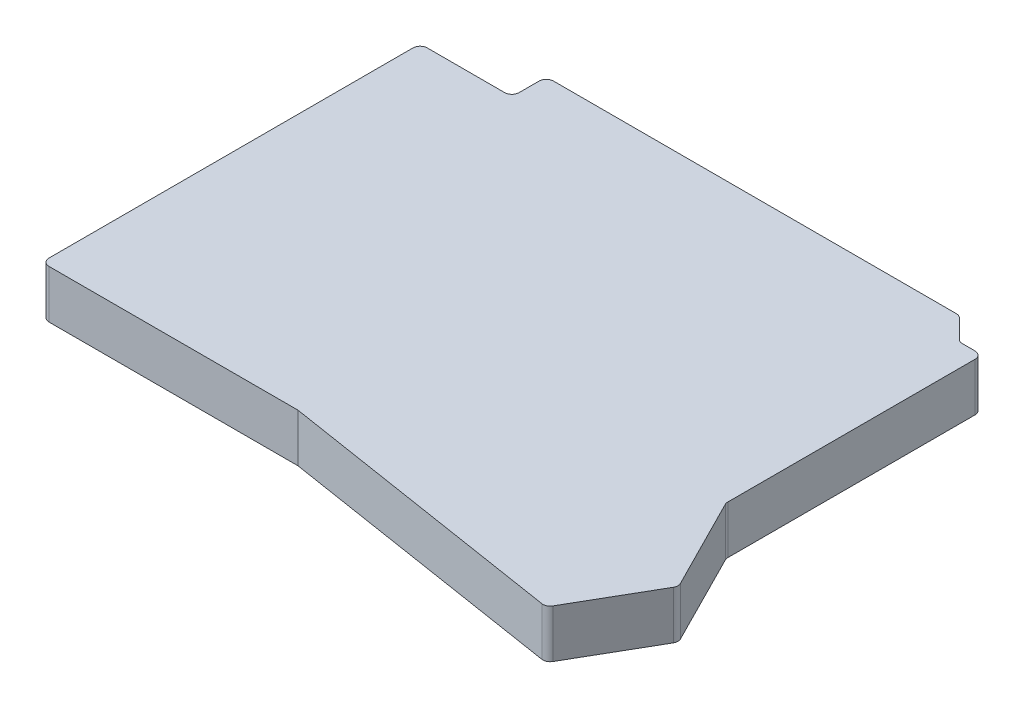
ISO-10303-21;
HEADER;
FILE_DESCRIPTION(('STEP AP214'),'2;1');
FILE_NAME('part.step','',(''),(''),'','','');
FILE_SCHEMA(('AUTOMOTIVE_DESIGN { 1 0 10303 214 1 1 1 1 }'));
ENDSEC;
DATA;
#1=APPLICATION_CONTEXT('core data for automotive mechanical design processes');
#2=APPLICATION_PROTOCOL_DEFINITION('international standard','automotive_design',2000,#1);
#3=PRODUCT_CONTEXT('',#1,'mechanical');
#4=PRODUCT('Part','Part','',(#3));
#5=PRODUCT_RELATED_PRODUCT_CATEGORY('part','',(#4));
#6=PRODUCT_DEFINITION_FORMATION('','',#4);
#7=PRODUCT_DEFINITION_CONTEXT('part definition',#1,'design');
#8=PRODUCT_DEFINITION('design','',#6,#7);
#9=PRODUCT_DEFINITION_SHAPE('','',#8);
#10=(LENGTH_UNIT() NAMED_UNIT(*) SI_UNIT(.MILLI.,.METRE.));
#11=(NAMED_UNIT(*) PLANE_ANGLE_UNIT() SI_UNIT($,.RADIAN.));
#12=(NAMED_UNIT(*) SI_UNIT($,.STERADIAN.) SOLID_ANGLE_UNIT());
#13=UNCERTAINTY_MEASURE_WITH_UNIT(LENGTH_MEASURE(1.E-05),#10,'distance_accuracy_value','');
#14=(GEOMETRIC_REPRESENTATION_CONTEXT(3) GLOBAL_UNCERTAINTY_ASSIGNED_CONTEXT((#13)) GLOBAL_UNIT_ASSIGNED_CONTEXT((#10,
#11,#12)) REPRESENTATION_CONTEXT('',''));
#15=CARTESIAN_POINT('',(0.,0.,0.));
#16=DIRECTION('',(0.,0.,1.));
#17=DIRECTION('',(1.,0.,0.));
#18=AXIS2_PLACEMENT_3D('',#15,#16,#17);
#19=CARTESIAN_POINT('',(1.5,10.,19.87));
#20=DIRECTION('',(0.,-1.,0.));
#21=DIRECTION('',(0.,0.,-1.));
#22=AXIS2_PLACEMENT_3D('',#19,#20,#21);
#23=CYLINDRICAL_SURFACE('',#22,1.5);
#24=CARTESIAN_POINT('',(1.5,0.,19.87));
#25=DIRECTION('',(0.,1.,0.));
#26=DIRECTION('',(0.,0.,1.));
#27=AXIS2_PLACEMENT_3D('',#24,#25,#26);
#28=CIRCLE('',#27,1.5);
#29=CARTESIAN_POINT('',(0.,0.,19.87));
#30=VERTEX_POINT('',#29);
#31=CARTESIAN_POINT('',(1.50000000000001,0.,21.37));
#32=VERTEX_POINT('',#31);
#33=EDGE_CURVE('E217',#30,#32,#28,.T.);
#34=ORIENTED_EDGE('',*,*,#33,.T.);
#35=DIRECTION('',(0.,-1.,0.));
#36=VECTOR('',#35,1.);
#37=CARTESIAN_POINT('',(1.50000000000001,10.,21.37));
#38=LINE('',#37,#36);
#39=CARTESIAN_POINT('',(1.50000000000001,10.,21.37));
#40=VERTEX_POINT('',#39);
#41=EDGE_CURVE('E41',#40,#32,#38,.T.);
#42=ORIENTED_EDGE('',*,*,#41,.F.);
#43=CARTESIAN_POINT('',(1.5,10.,19.87));
#44=DIRECTION('',(0.,1.,0.));
#45=DIRECTION('',(0.,0.,1.));
#46=AXIS2_PLACEMENT_3D('',#43,#44,#45);
#47=CIRCLE('',#46,1.5);
#48=CARTESIAN_POINT('',(0.,10.,19.87));
#49=VERTEX_POINT('',#48);
#50=EDGE_CURVE('E135',#49,#40,#47,.T.);
#51=ORIENTED_EDGE('',*,*,#50,.F.);
#52=DIRECTION('',(0.,-1.,0.));
#53=VECTOR('',#52,1.);
#54=CARTESIAN_POINT('',(0.,10.,19.87));
#55=LINE('',#54,#53);
#56=EDGE_CURVE('E11',#49,#30,#55,.T.);
#57=ORIENTED_EDGE('',*,*,#56,.T.);
#58=EDGE_LOOP('',(#34,#42,#51,#57));
#59=FACE_BOUND('',#58,.T.);
#60=ADVANCED_FACE('F33',(#59),#23,.T.);
#61=CARTESIAN_POINT('',(1.50000000000001,10.,21.37));
#62=DIRECTION('',(0.,0.,-1.));
#63=DIRECTION('',(-1.,0.,0.));
#64=AXIS2_PLACEMENT_3D('',#61,#62,#63);
#65=PLANE('',#64);
#66=DIRECTION('',(1.,0.,0.));
#67=VECTOR('',#66,1.);
#68=CARTESIAN_POINT('',(1.50000000000001,0.,21.37));
#69=LINE('',#68,#67);
#70=CARTESIAN_POINT('',(53.0324982708608,0.,21.37));
#71=VERTEX_POINT('',#70);
#72=EDGE_CURVE('E219',#32,#71,#69,.T.);
#73=ORIENTED_EDGE('',*,*,#72,.T.);
#74=DIRECTION('',(0.,-1.,0.));
#75=VECTOR('',#74,1.);
#76=CARTESIAN_POINT('',(53.0324982708608,10.,21.37));
#77=LINE('',#76,#75);
#78=CARTESIAN_POINT('',(53.0324982708608,10.,21.37));
#79=VERTEX_POINT('',#78);
#80=EDGE_CURVE('E306',#79,#71,#77,.T.);
#81=ORIENTED_EDGE('',*,*,#80,.F.);
#82=DIRECTION('',(1.,0.,0.));
#83=VECTOR('',#82,1.);
#84=CARTESIAN_POINT('',(1.50000000000001,10.,21.37));
#85=LINE('',#84,#83);
#86=EDGE_CURVE('E314',#40,#79,#85,.T.);
#87=ORIENTED_EDGE('',*,*,#86,.F.);
#88=ORIENTED_EDGE('',*,*,#41,.T.);
#89=EDGE_LOOP('',(#73,#81,#87,#88));
#90=FACE_BOUND('',#89,.T.);
#91=ADVANCED_FACE('F312',(#90),#65,.F.);
#92=CARTESIAN_POINT('',(53.0324982708608,10.,22.87));
#93=DIRECTION('',(0.,-1.,0.));
#94=DIRECTION('',(0.,0.,-1.));
#95=AXIS2_PLACEMENT_3D('',#92,#93,#94);
#96=CYLINDRICAL_SURFACE('',#95,1.5);
#97=CARTESIAN_POINT('',(53.0324982708608,0.,22.87));
#98=DIRECTION('',(0.,-1.,0.));
#99=DIRECTION('',(0.,0.,-1.));
#100=AXIS2_PLACEMENT_3D('',#97,#98,#99);
#101=CIRCLE('',#100,1.5);
#102=CARTESIAN_POINT('',(53.2660684742362,0.,21.388296601848));
#103=VERTEX_POINT('',#102);
#104=EDGE_CURVE('E221',#71,#103,#101,.T.);
#105=ORIENTED_EDGE('',*,*,#104,.T.);
#106=DIRECTION('',(0.,-1.,0.));
#107=VECTOR('',#106,1.);
#108=CARTESIAN_POINT('',(53.2660684742362,10.,21.388296601848));
#109=LINE('',#108,#107);
#110=CARTESIAN_POINT('',(53.2660684742362,10.,21.388296601848));
#111=VERTEX_POINT('',#110);
#112=EDGE_CURVE('E303',#111,#103,#109,.T.);
#113=ORIENTED_EDGE('',*,*,#112,.F.);
#114=CARTESIAN_POINT('',(53.0324982708608,10.,22.87));
#115=DIRECTION('',(0.,-1.,0.));
#116=DIRECTION('',(0.,0.,-1.));
#117=AXIS2_PLACEMENT_3D('',#114,#115,#116);
#118=CIRCLE('',#117,1.5);
#119=EDGE_CURVE('E333',#79,#111,#118,.T.);
#120=ORIENTED_EDGE('',*,*,#119,.F.);
#121=ORIENTED_EDGE('',*,*,#80,.T.);
#122=EDGE_LOOP('',(#105,#113,#120,#121));
#123=FACE_BOUND('',#122,.T.);
#124=ADVANCED_FACE('F324',(#123),#96,.F.);
#125=CARTESIAN_POINT('',(53.2660684742362,10.,21.388296601848));
#126=DIRECTION('',(0.155713468916939,0.,-0.987802265434663));
#127=DIRECTION('',(-0.987802265434664,0.,-0.155713468916939));
#128=AXIS2_PLACEMENT_3D('',#125,#126,#127);
#129=PLANE('',#128);
#130=DIRECTION('',(0.987802265434664,0.,0.155713468916939));
#131=VECTOR('',#130,1.);
#132=CARTESIAN_POINT('',(53.2660684742362,0.,21.388296601848));
#133=LINE('',#132,#131);
#134=CARTESIAN_POINT('',(113.222449486146,0.,30.8395971280339));
#135=VERTEX_POINT('',#134);
#136=EDGE_CURVE('E223',#103,#135,#133,.T.);
#137=ORIENTED_EDGE('',*,*,#136,.T.);
#138=DIRECTION('',(0.,-1.,0.));
#139=VECTOR('',#138,1.);
#140=CARTESIAN_POINT('',(113.222449486146,10.,30.8395971280339));
#141=LINE('',#140,#139);
#142=CARTESIAN_POINT('',(113.222449486146,10.,30.8395971280339));
#143=VERTEX_POINT('',#142);
#144=EDGE_CURVE('E300',#143,#135,#141,.T.);
#145=ORIENTED_EDGE('',*,*,#144,.F.);
#146=DIRECTION('',(0.987802265434664,0.,0.155713468916939));
#147=VECTOR('',#146,1.);
#148=CARTESIAN_POINT('',(53.2660684742362,10.,21.388296601848));
#149=LINE('',#148,#147);
#150=EDGE_CURVE('E330',#111,#143,#149,.T.);
#151=ORIENTED_EDGE('',*,*,#150,.F.);
#152=ORIENTED_EDGE('',*,*,#112,.T.);
#153=EDGE_LOOP('',(#137,#145,#151,#152));
#154=FACE_BOUND('',#153,.T.);
#155=ADVANCED_FACE('F328',(#154),#129,.F.);
#156=CARTESIAN_POINT('',(113.456019689522,10.,29.3578937298819));
#157=DIRECTION('',(0.,-1.,0.));
#158=DIRECTION('',(0.,0.,-1.));
#159=AXIS2_PLACEMENT_3D('',#156,#157,#158);
#160=CYLINDRICAL_SURFACE('',#159,1.5);
#161=CARTESIAN_POINT('',(113.456019689522,0.,29.3578937298819));
#162=DIRECTION('',(0.,1.,0.));
#163=DIRECTION('',(0.,0.,-1.));
#164=AXIS2_PLACEMENT_3D('',#161,#162,#163);
#165=CIRCLE('',#164,1.5);
#166=CARTESIAN_POINT('',(114.755057795198,0.,30.1078937298819));
#167=VERTEX_POINT('',#166);
#168=EDGE_CURVE('E225',#135,#167,#165,.T.);
#169=ORIENTED_EDGE('',*,*,#168,.T.);
#170=DIRECTION('',(0.,-1.,0.));
#171=VECTOR('',#170,1.);
#172=CARTESIAN_POINT('',(114.755057795198,10.,30.1078937298819));
#173=LINE('',#172,#171);
#174=CARTESIAN_POINT('',(114.755057795198,10.,30.1078937298819));
#175=VERTEX_POINT('',#174);
#176=EDGE_CURVE('E297',#175,#167,#173,.T.);
#177=ORIENTED_EDGE('',*,*,#176,.F.);
#178=CARTESIAN_POINT('',(113.456019689522,10.,29.3578937298819));
#179=DIRECTION('',(0.,1.,0.));
#180=DIRECTION('',(0.,0.,-1.));
#181=AXIS2_PLACEMENT_3D('',#178,#179,#180);
#182=CIRCLE('',#181,1.5);
#183=EDGE_CURVE('E332',#143,#175,#182,.T.);
#184=ORIENTED_EDGE('',*,*,#183,.F.);
#185=ORIENTED_EDGE('',*,*,#144,.T.);
#186=EDGE_LOOP('',(#169,#177,#184,#185));
#187=FACE_BOUND('',#186,.T.);
#188=ADVANCED_FACE('F395',(#187),#160,.T.);
#189=CARTESIAN_POINT('',(114.755057795198,10.,30.1078937298819));
#190=DIRECTION('',(-0.86602540378444,0.,-0.499999999999997));
#191=DIRECTION('',(-0.499999999999997,0.,0.86602540378444));
#192=AXIS2_PLACEMENT_3D('',#189,#190,#191);
#193=PLANE('',#192);
#194=DIRECTION('',(0.499999999999997,0.,-0.86602540378444));
#195=VECTOR('',#194,1.);
#196=CARTESIAN_POINT('',(114.755057795198,0.,30.1078937298819));
#197=LINE('',#196,#195);
#198=CARTESIAN_POINT('',(123.908801296402,0.,14.2531449063435));
#199=VERTEX_POINT('',#198);
#200=EDGE_CURVE('E227',#167,#199,#197,.T.);
#201=ORIENTED_EDGE('',*,*,#200,.T.);
#202=DIRECTION('',(0.,-1.,0.));
#203=VECTOR('',#202,1.);
#204=CARTESIAN_POINT('',(123.908801296402,10.,14.2531449063435));
#205=LINE('',#204,#203);
#206=CARTESIAN_POINT('',(123.908801296402,10.,14.2531449063435));
#207=VERTEX_POINT('',#206);
#208=EDGE_CURVE('E294',#207,#199,#205,.T.);
#209=ORIENTED_EDGE('',*,*,#208,.F.);
#210=DIRECTION('',(0.499999999999997,0.,-0.86602540378444));
#211=VECTOR('',#210,1.);
#212=CARTESIAN_POINT('',(114.755057795198,10.,30.1078937298819));
#213=LINE('',#212,#211);
#214=EDGE_CURVE('E335',#175,#207,#213,.T.);
#215=ORIENTED_EDGE('',*,*,#214,.F.);
#216=ORIENTED_EDGE('',*,*,#176,.T.);
#217=EDGE_LOOP('',(#201,#209,#215,#216));
#218=FACE_BOUND('',#217,.T.);
#219=ADVANCED_FACE('F398',(#218),#193,.F.);
#220=CARTESIAN_POINT('',(122.609763190726,10.,13.5031449063435));
#221=DIRECTION('',(0.,-1.,0.));
#222=DIRECTION('',(0.,0.,-1.));
#223=AXIS2_PLACEMENT_3D('',#220,#221,#222);
#224=CYLINDRICAL_SURFACE('',#223,1.49999999999998);
#225=CARTESIAN_POINT('',(122.609763190726,0.,13.5031449063435));
#226=DIRECTION('',(0.,1.,0.));
#227=DIRECTION('',(0.,0.,1.));
#228=AXIS2_PLACEMENT_3D('',#225,#226,#227);
#229=CIRCLE('',#228,1.49999999999998);
#230=CARTESIAN_POINT('',(123.94803110144,0.,12.8256207376596));
#231=VERTEX_POINT('',#230);
#232=EDGE_CURVE('E229',#199,#231,#229,.T.);
#233=ORIENTED_EDGE('',*,*,#232,.T.);
#234=DIRECTION('',(0.,-1.,0.));
#235=VECTOR('',#234,1.);
#236=CARTESIAN_POINT('',(123.94803110144,10.,12.8256207376596));
#237=LINE('',#236,#235);
#238=CARTESIAN_POINT('',(123.94803110144,10.,12.8256207376596));
#239=VERTEX_POINT('',#238);
#240=EDGE_CURVE('E291',#239,#231,#237,.T.);
#241=ORIENTED_EDGE('',*,*,#240,.F.);
#242=CARTESIAN_POINT('',(122.609763190726,10.,13.5031449063435));
#243=DIRECTION('',(0.,1.,0.));
#244=DIRECTION('',(0.,0.,1.));
#245=AXIS2_PLACEMENT_3D('',#242,#243,#244);
#246=CIRCLE('',#245,1.49999999999998);
#247=EDGE_CURVE('E341',#207,#239,#246,.T.);
#248=ORIENTED_EDGE('',*,*,#247,.F.);
#249=ORIENTED_EDGE('',*,*,#208,.T.);
#250=EDGE_LOOP('',(#233,#241,#248,#249));
#251=FACE_BOUND('',#250,.T.);
#252=ADVANCED_FACE('F402',(#251),#224,.T.);
#253=CARTESIAN_POINT('',(123.94803110144,10.,12.8256207376596));
#254=DIRECTION('',(-0.89217860714327,0.,0.451682779122578));
#255=DIRECTION('',(0.451682779122578,0.,0.89217860714327));
#256=AXIS2_PLACEMENT_3D('',#253,#254,#255);
#257=PLANE('',#256);
#258=DIRECTION('',(-0.451682779122578,0.,-0.892178607143269));
#259=VECTOR('',#258,1.);
#260=CARTESIAN_POINT('',(123.94803110144,0.,12.8256207376596));
#261=LINE('',#260,#259);
#262=CARTESIAN_POINT('',(114.401732089285,0.,-6.0305414843819));
#263=VERTEX_POINT('',#262);
#264=EDGE_CURVE('E231',#231,#263,#261,.T.);
#265=ORIENTED_EDGE('',*,*,#264,.T.);
#266=DIRECTION('',(0.,-1.,0.));
#267=VECTOR('',#266,1.);
#268=CARTESIAN_POINT('',(114.401732089285,10.,-6.0305414843819));
#269=LINE('',#268,#267);
#270=CARTESIAN_POINT('',(114.401732089285,10.,-6.0305414843819));
#271=VERTEX_POINT('',#270);
#272=EDGE_CURVE('E288',#271,#263,#269,.T.);
#273=ORIENTED_EDGE('',*,*,#272,.F.);
#274=DIRECTION('',(-0.451682779122578,0.,-0.892178607143269));
#275=VECTOR('',#274,1.);
#276=CARTESIAN_POINT('',(123.94803110144,10.,12.8256207376596));
#277=LINE('',#276,#275);
#278=EDGE_CURVE('E343',#239,#271,#277,.T.);
#279=ORIENTED_EDGE('',*,*,#278,.F.);
#280=ORIENTED_EDGE('',*,*,#240,.T.);
#281=EDGE_LOOP('',(#265,#273,#279,#280));
#282=FACE_BOUND('',#281,.T.);
#283=ADVANCED_FACE('F406',(#282),#257,.F.);
#284=CARTESIAN_POINT('',(115.74,10.,-6.70806565306578));
#285=DIRECTION('',(0.,-1.,0.));
#286=DIRECTION('',(0.,0.,-1.));
#287=AXIS2_PLACEMENT_3D('',#284,#285,#286);
#288=CYLINDRICAL_SURFACE('',#287,1.5);
#289=CARTESIAN_POINT('',(115.74,0.,-6.70806565306578));
#290=DIRECTION('',(0.,-1.,0.));
#291=DIRECTION('',(0.,0.,-1.));
#292=AXIS2_PLACEMENT_3D('',#289,#290,#291);
#293=CIRCLE('',#292,1.5);
#294=CARTESIAN_POINT('',(114.24,0.,-6.70806565306578));
#295=VERTEX_POINT('',#294);
#296=EDGE_CURVE('E233',#263,#295,#293,.T.);
#297=ORIENTED_EDGE('',*,*,#296,.T.);
#298=DIRECTION('',(0.,-1.,0.));
#299=VECTOR('',#298,1.);
#300=CARTESIAN_POINT('',(114.24,10.,-6.70806565306578));
#301=LINE('',#300,#299);
#302=CARTESIAN_POINT('',(114.24,10.,-6.70806565306578));
#303=VERTEX_POINT('',#302);
#304=EDGE_CURVE('E285',#303,#295,#301,.T.);
#305=ORIENTED_EDGE('',*,*,#304,.F.);
#306=CARTESIAN_POINT('',(115.74,10.,-6.70806565306578));
#307=DIRECTION('',(0.,-1.,0.));
#308=DIRECTION('',(0.,0.,-1.));
#309=AXIS2_PLACEMENT_3D('',#306,#307,#308);
#310=CIRCLE('',#309,1.5);
#311=EDGE_CURVE('E345',#271,#303,#310,.T.);
#312=ORIENTED_EDGE('',*,*,#311,.F.);
#313=ORIENTED_EDGE('',*,*,#272,.T.);
#314=EDGE_LOOP('',(#297,#305,#312,#313));
#315=FACE_BOUND('',#314,.T.);
#316=ADVANCED_FACE('F410',(#315),#288,.F.);
#317=CARTESIAN_POINT('',(114.24,10.,-58.));
#318=DIRECTION('',(-1.,0.,0.));
#319=DIRECTION('',(0.,0.,1.));
#320=AXIS2_PLACEMENT_3D('',#317,#318,#319);
#321=PLANE('',#320);
#322=DIRECTION('',(0.,0.,-1.));
#323=VECTOR('',#322,1.);
#324=CARTESIAN_POINT('',(114.24,0.,-58.));
#325=LINE('',#324,#323);
#326=CARTESIAN_POINT('',(114.24,0.,-58.));
#327=VERTEX_POINT('',#326);
#328=EDGE_CURVE('E235',#295,#327,#325,.T.);
#329=ORIENTED_EDGE('',*,*,#328,.T.);
#330=DIRECTION('',(0.,-1.,0.));
#331=VECTOR('',#330,1.);
#332=CARTESIAN_POINT('',(114.24,10.,-58.));
#333=LINE('',#332,#331);
#334=CARTESIAN_POINT('',(114.24,10.,-58.));
#335=VERTEX_POINT('',#334);
#336=EDGE_CURVE('E282',#335,#327,#333,.T.);
#337=ORIENTED_EDGE('',*,*,#336,.F.);
#338=DIRECTION('',(0.,0.,-1.));
#339=VECTOR('',#338,1.);
#340=CARTESIAN_POINT('',(114.24,10.,-58.));
#341=LINE('',#340,#339);
#342=EDGE_CURVE('E347',#303,#335,#341,.T.);
#343=ORIENTED_EDGE('',*,*,#342,.F.);
#344=ORIENTED_EDGE('',*,*,#304,.T.);
#345=EDGE_LOOP('',(#329,#337,#343,#344));
#346=FACE_BOUND('',#345,.T.);
#347=ADVANCED_FACE('F414',(#346),#321,.F.);
#348=CARTESIAN_POINT('',(112.74,10.,-58.));
#349=DIRECTION('',(0.,-1.,0.));
#350=DIRECTION('',(0.,0.,-1.));
#351=AXIS2_PLACEMENT_3D('',#348,#349,#350);
#352=CYLINDRICAL_SURFACE('',#351,1.5);
#353=CARTESIAN_POINT('',(112.74,0.,-58.));
#354=DIRECTION('',(0.,1.,0.));
#355=DIRECTION('',(0.,0.,-1.));
#356=AXIS2_PLACEMENT_3D('',#353,#354,#355);
#357=CIRCLE('',#356,1.5);
#358=CARTESIAN_POINT('',(112.74,0.,-59.5));
#359=VERTEX_POINT('',#358);
#360=EDGE_CURVE('E237',#327,#359,#357,.T.);
#361=ORIENTED_EDGE('',*,*,#360,.T.);
#362=DIRECTION('',(0.,-1.,0.));
#363=VECTOR('',#362,1.);
#364=CARTESIAN_POINT('',(112.74,10.,-59.5));
#365=LINE('',#364,#363);
#366=CARTESIAN_POINT('',(112.74,10.,-59.5));
#367=VERTEX_POINT('',#366);
#368=EDGE_CURVE('E279',#367,#359,#365,.T.);
#369=ORIENTED_EDGE('',*,*,#368,.F.);
#370=CARTESIAN_POINT('',(112.74,10.,-58.));
#371=DIRECTION('',(0.,1.,0.));
#372=DIRECTION('',(0.,0.,-1.));
#373=AXIS2_PLACEMENT_3D('',#370,#371,#372);
#374=CIRCLE('',#373,1.5);
#375=EDGE_CURVE('E349',#335,#367,#374,.T.);
#376=ORIENTED_EDGE('',*,*,#375,.F.);
#377=ORIENTED_EDGE('',*,*,#336,.T.);
#378=EDGE_LOOP('',(#361,#369,#376,#377));
#379=FACE_BOUND('',#378,.T.);
#380=ADVANCED_FACE('F418',(#379),#352,.T.);
#381=CARTESIAN_POINT('',(110.10132034356,10.,-59.5));
#382=DIRECTION('',(0.,0.,1.));
#383=DIRECTION('',(1.,0.,0.));
#384=AXIS2_PLACEMENT_3D('',#381,#382,#383);
#385=PLANE('',#384);
#386=DIRECTION('',(-1.,0.,0.));
#387=VECTOR('',#386,1.);
#388=CARTESIAN_POINT('',(110.10132034356,0.,-59.5));
#389=LINE('',#388,#387);
#390=CARTESIAN_POINT('',(110.10132034356,0.,-59.5));
#391=VERTEX_POINT('',#390);
#392=EDGE_CURVE('E239',#359,#391,#389,.T.);
#393=ORIENTED_EDGE('',*,*,#392,.T.);
#394=DIRECTION('',(0.,-1.,0.));
#395=VECTOR('',#394,1.);
#396=CARTESIAN_POINT('',(110.10132034356,10.,-59.5));
#397=LINE('',#396,#395);
#398=CARTESIAN_POINT('',(110.10132034356,10.,-59.5));
#399=VERTEX_POINT('',#398);
#400=EDGE_CURVE('E276',#399,#391,#397,.T.);
#401=ORIENTED_EDGE('',*,*,#400,.F.);
#402=DIRECTION('',(-1.,0.,0.));
#403=VECTOR('',#402,1.);
#404=CARTESIAN_POINT('',(110.10132034356,10.,-59.5));
#405=LINE('',#404,#403);
#406=EDGE_CURVE('E351',#367,#399,#405,.T.);
#407=ORIENTED_EDGE('',*,*,#406,.F.);
#408=ORIENTED_EDGE('',*,*,#368,.T.);
#409=EDGE_LOOP('',(#393,#401,#407,#408));
#410=FACE_BOUND('',#409,.T.);
#411=ADVANCED_FACE('F422',(#410),#385,.F.);
#412=CARTESIAN_POINT('',(110.10132034356,10.,-61.));
#413=DIRECTION('',(0.,-1.,0.));
#414=DIRECTION('',(0.,0.,-1.));
#415=AXIS2_PLACEMENT_3D('',#412,#413,#414);
#416=CYLINDRICAL_SURFACE('',#415,1.5);
#417=CARTESIAN_POINT('',(110.10132034356,0.,-61.));
#418=DIRECTION('',(0.,-1.,0.));
#419=DIRECTION('',(0.,0.,1.));
#420=AXIS2_PLACEMENT_3D('',#417,#418,#419);
#421=CIRCLE('',#420,1.5);
#422=CARTESIAN_POINT('',(109.04066017178,0.,-59.9393398282202));
#423=VERTEX_POINT('',#422);
#424=EDGE_CURVE('E241',#391,#423,#421,.T.);
#425=ORIENTED_EDGE('',*,*,#424,.T.);
#426=DIRECTION('',(0.,-1.,0.));
#427=VECTOR('',#426,1.);
#428=CARTESIAN_POINT('',(109.04066017178,10.,-59.9393398282202));
#429=LINE('',#428,#427);
#430=CARTESIAN_POINT('',(109.04066017178,10.,-59.9393398282202));
#431=VERTEX_POINT('',#430);
#432=EDGE_CURVE('E273',#431,#423,#429,.T.);
#433=ORIENTED_EDGE('',*,*,#432,.F.);
#434=CARTESIAN_POINT('',(110.10132034356,10.,-61.));
#435=DIRECTION('',(0.,-1.,0.));
#436=DIRECTION('',(0.,0.,1.));
#437=AXIS2_PLACEMENT_3D('',#434,#435,#436);
#438=CIRCLE('',#437,1.5);
#439=EDGE_CURVE('E353',#399,#431,#438,.T.);
#440=ORIENTED_EDGE('',*,*,#439,.F.);
#441=ORIENTED_EDGE('',*,*,#400,.T.);
#442=EDGE_LOOP('',(#425,#433,#440,#441));
#443=FACE_BOUND('',#442,.T.);
#444=ADVANCED_FACE('F426',(#443),#416,.F.);
#445=CARTESIAN_POINT('',(105.15933982822,10.,-63.8206601717798));
#446=DIRECTION('',(-0.707106781186549,0.,0.707106781186546));
#447=DIRECTION('',(0.707106781186546,0.,0.707106781186549));
#448=AXIS2_PLACEMENT_3D('',#445,#446,#447);
#449=PLANE('',#448);
#450=DIRECTION('',(-0.707106781186546,0.,-0.707106781186549));
#451=VECTOR('',#450,1.);
#452=CARTESIAN_POINT('',(105.15933982822,0.,-63.8206601717798));
#453=LINE('',#452,#451);
#454=CARTESIAN_POINT('',(105.15933982822,0.,-63.8206601717798));
#455=VERTEX_POINT('',#454);
#456=EDGE_CURVE('E243',#423,#455,#453,.T.);
#457=ORIENTED_EDGE('',*,*,#456,.T.);
#458=DIRECTION('',(0.,-1.,0.));
#459=VECTOR('',#458,1.);
#460=CARTESIAN_POINT('',(105.15933982822,10.,-63.8206601717798));
#461=LINE('',#460,#459);
#462=CARTESIAN_POINT('',(105.15933982822,10.,-63.8206601717798));
#463=VERTEX_POINT('',#462);
#464=EDGE_CURVE('E270',#463,#455,#461,.T.);
#465=ORIENTED_EDGE('',*,*,#464,.F.);
#466=DIRECTION('',(-0.707106781186546,0.,-0.707106781186549));
#467=VECTOR('',#466,1.);
#468=CARTESIAN_POINT('',(105.15933982822,10.,-63.8206601717798));
#469=LINE('',#468,#467);
#470=EDGE_CURVE('E355',#431,#463,#469,.T.);
#471=ORIENTED_EDGE('',*,*,#470,.F.);
#472=ORIENTED_EDGE('',*,*,#432,.T.);
#473=EDGE_LOOP('',(#457,#465,#471,#472));
#474=FACE_BOUND('',#473,.T.);
#475=ADVANCED_FACE('F430',(#474),#449,.F.);
#476=CARTESIAN_POINT('',(104.09867965644,10.,-62.76));
#477=DIRECTION('',(0.,-1.,0.));
#478=DIRECTION('',(0.,0.,-1.));
#479=AXIS2_PLACEMENT_3D('',#476,#477,#478);
#480=CYLINDRICAL_SURFACE('',#479,1.5);
#481=CARTESIAN_POINT('',(104.09867965644,0.,-62.76));
#482=DIRECTION('',(0.,1.,0.));
#483=DIRECTION('',(0.,0.,-1.));
#484=AXIS2_PLACEMENT_3D('',#481,#482,#483);
#485=CIRCLE('',#484,1.5);
#486=CARTESIAN_POINT('',(104.09867965644,0.,-64.26));
#487=VERTEX_POINT('',#486);
#488=EDGE_CURVE('E245',#455,#487,#485,.T.);
#489=ORIENTED_EDGE('',*,*,#488,.T.);
#490=DIRECTION('',(0.,-1.,0.));
#491=VECTOR('',#490,1.);
#492=CARTESIAN_POINT('',(104.09867965644,10.,-64.26));
#493=LINE('',#492,#491);
#494=CARTESIAN_POINT('',(104.09867965644,10.,-64.26));
#495=VERTEX_POINT('',#494);
#496=EDGE_CURVE('E267',#495,#487,#493,.T.);
#497=ORIENTED_EDGE('',*,*,#496,.F.);
#498=CARTESIAN_POINT('',(104.09867965644,10.,-62.76));
#499=DIRECTION('',(0.,1.,0.));
#500=DIRECTION('',(0.,0.,-1.));
#501=AXIS2_PLACEMENT_3D('',#498,#499,#500);
#502=CIRCLE('',#501,1.5);
#503=EDGE_CURVE('E357',#463,#495,#502,.T.);
#504=ORIENTED_EDGE('',*,*,#503,.F.);
#505=ORIENTED_EDGE('',*,*,#464,.T.);
#506=EDGE_LOOP('',(#489,#497,#504,#505));
#507=FACE_BOUND('',#506,.T.);
#508=ADVANCED_FACE('F434',(#507),#480,.T.);
#509=CARTESIAN_POINT('',(20.54,10.,-64.26));
#510=DIRECTION('',(0.,0.,1.));
#511=DIRECTION('',(1.,0.,0.));
#512=AXIS2_PLACEMENT_3D('',#509,#510,#511);
#513=PLANE('',#512);
#514=DIRECTION('',(-1.,0.,0.));
#515=VECTOR('',#514,1.);
#516=CARTESIAN_POINT('',(20.54,0.,-64.26));
#517=LINE('',#516,#515);
#518=CARTESIAN_POINT('',(20.54,0.,-64.26));
#519=VERTEX_POINT('',#518);
#520=EDGE_CURVE('E247',#487,#519,#517,.T.);
#521=ORIENTED_EDGE('',*,*,#520,.T.);
#522=DIRECTION('',(0.,-1.,0.));
#523=VECTOR('',#522,1.);
#524=CARTESIAN_POINT('',(20.54,10.,-64.26));
#525=LINE('',#524,#523);
#526=CARTESIAN_POINT('',(20.54,10.,-64.26));
#527=VERTEX_POINT('',#526);
#528=EDGE_CURVE('E264',#527,#519,#525,.T.);
#529=ORIENTED_EDGE('',*,*,#528,.F.);
#530=DIRECTION('',(-1.,0.,0.));
#531=VECTOR('',#530,1.);
#532=CARTESIAN_POINT('',(20.54,10.,-64.26));
#533=LINE('',#532,#531);
#534=EDGE_CURVE('E359',#495,#527,#533,.T.);
#535=ORIENTED_EDGE('',*,*,#534,.F.);
#536=ORIENTED_EDGE('',*,*,#496,.T.);
#537=EDGE_LOOP('',(#521,#529,#535,#536));
#538=FACE_BOUND('',#537,.T.);
#539=ADVANCED_FACE('F438',(#538),#513,.F.);
#540=CARTESIAN_POINT('',(20.54,10.,-62.76));
#541=DIRECTION('',(0.,-1.,0.));
#542=DIRECTION('',(0.,0.,-1.));
#543=AXIS2_PLACEMENT_3D('',#540,#541,#542);
#544=CYLINDRICAL_SURFACE('',#543,1.5);
#545=CARTESIAN_POINT('',(20.54,0.,-62.76));
#546=DIRECTION('',(0.,1.,0.));
#547=DIRECTION('',(0.,0.,-1.));
#548=AXIS2_PLACEMENT_3D('',#545,#546,#547);
#549=CIRCLE('',#548,1.5);
#550=CARTESIAN_POINT('',(19.04,0.,-62.76));
#551=VERTEX_POINT('',#550);
#552=EDGE_CURVE('E249',#519,#551,#549,.T.);
#553=ORIENTED_EDGE('',*,*,#552,.T.);
#554=DIRECTION('',(0.,-1.,0.));
#555=VECTOR('',#554,1.);
#556=CARTESIAN_POINT('',(19.04,10.,-62.76));
#557=LINE('',#556,#555);
#558=CARTESIAN_POINT('',(19.04,10.,-62.76));
#559=VERTEX_POINT('',#558);
#560=EDGE_CURVE('E261',#559,#551,#557,.T.);
#561=ORIENTED_EDGE('',*,*,#560,.F.);
#562=CARTESIAN_POINT('',(20.54,10.,-62.76));
#563=DIRECTION('',(0.,1.,0.));
#564=DIRECTION('',(0.,0.,-1.));
#565=AXIS2_PLACEMENT_3D('',#562,#563,#564);
#566=CIRCLE('',#565,1.5);
#567=EDGE_CURVE('E361',#527,#559,#566,.T.);
#568=ORIENTED_EDGE('',*,*,#567,.F.);
#569=ORIENTED_EDGE('',*,*,#528,.T.);
#570=EDGE_LOOP('',(#553,#561,#568,#569));
#571=FACE_BOUND('',#570,.T.);
#572=ADVANCED_FACE('F367',(#571),#544,.T.);
#573=CARTESIAN_POINT('',(19.04,10.,-58.62));
#574=DIRECTION('',(1.,0.,0.));
#575=DIRECTION('',(0.,0.,-1.));
#576=AXIS2_PLACEMENT_3D('',#573,#574,#575);
#577=PLANE('',#576);
#578=DIRECTION('',(0.,0.,1.));
#579=VECTOR('',#578,1.);
#580=CARTESIAN_POINT('',(19.04,0.,-58.62));
#581=LINE('',#580,#579);
#582=CARTESIAN_POINT('',(19.04,0.,-58.62));
#583=VERTEX_POINT('',#582);
#584=EDGE_CURVE('E251',#551,#583,#581,.T.);
#585=ORIENTED_EDGE('',*,*,#584,.T.);
#586=DIRECTION('',(0.,-1.,0.));
#587=VECTOR('',#586,1.);
#588=CARTESIAN_POINT('',(19.04,10.,-58.62));
#589=LINE('',#588,#587);
#590=CARTESIAN_POINT('',(19.04,10.,-58.62));
#591=VERTEX_POINT('',#590);
#592=EDGE_CURVE('E206',#591,#583,#589,.T.);
#593=ORIENTED_EDGE('',*,*,#592,.F.);
#594=DIRECTION('',(0.,0.,1.));
#595=VECTOR('',#594,1.);
#596=CARTESIAN_POINT('',(19.04,10.,-58.62));
#597=LINE('',#596,#595);
#598=EDGE_CURVE('E197',#559,#591,#597,.T.);
#599=ORIENTED_EDGE('',*,*,#598,.F.);
#600=ORIENTED_EDGE('',*,*,#560,.T.);
#601=EDGE_LOOP('',(#585,#593,#599,#600));
#602=FACE_BOUND('',#601,.T.);
#603=ADVANCED_FACE('F371',(#602),#577,.F.);
#604=CARTESIAN_POINT('',(17.54,10.,-58.62));
#605=DIRECTION('',(0.,-1.,0.));
#606=DIRECTION('',(0.,0.,-1.));
#607=AXIS2_PLACEMENT_3D('',#604,#605,#606);
#608=CYLINDRICAL_SURFACE('',#607,1.5);
#609=CARTESIAN_POINT('',(17.54,0.,-58.62));
#610=DIRECTION('',(0.,-1.,0.));
#611=DIRECTION('',(0.,0.,1.));
#612=AXIS2_PLACEMENT_3D('',#609,#610,#611);
#613=CIRCLE('',#612,1.5);
#614=CARTESIAN_POINT('',(17.54,0.,-57.12));
#615=VERTEX_POINT('',#614);
#616=EDGE_CURVE('E205',#583,#615,#613,.T.);
#617=ORIENTED_EDGE('',*,*,#616,.T.);
#618=DIRECTION('',(0.,-1.,0.));
#619=VECTOR('',#618,1.);
#620=CARTESIAN_POINT('',(17.54,10.,-57.12));
#621=LINE('',#620,#619);
#622=CARTESIAN_POINT('',(17.54,10.,-57.12));
#623=VERTEX_POINT('',#622);
#624=EDGE_CURVE('E202',#623,#615,#621,.T.);
#625=ORIENTED_EDGE('',*,*,#624,.F.);
#626=CARTESIAN_POINT('',(17.54,10.,-58.62));
#627=DIRECTION('',(0.,-1.,0.));
#628=DIRECTION('',(0.,0.,1.));
#629=AXIS2_PLACEMENT_3D('',#626,#627,#628);
#630=CIRCLE('',#629,1.5);
#631=EDGE_CURVE('E191',#591,#623,#630,.T.);
#632=ORIENTED_EDGE('',*,*,#631,.F.);
#633=ORIENTED_EDGE('',*,*,#592,.T.);
#634=EDGE_LOOP('',(#617,#625,#632,#633));
#635=FACE_BOUND('',#634,.T.);
#636=ADVANCED_FACE('F203',(#635),#608,.F.);
#637=CARTESIAN_POINT('',(1.50000000000001,10.,-57.12));
#638=DIRECTION('',(0.,0.,1.));
#639=DIRECTION('',(1.,0.,0.));
#640=AXIS2_PLACEMENT_3D('',#637,#638,#639);
#641=PLANE('',#640);
#642=DIRECTION('',(-1.,0.,0.));
#643=VECTOR('',#642,1.);
#644=CARTESIAN_POINT('',(1.50000000000001,0.,-57.12));
#645=LINE('',#644,#643);
#646=CARTESIAN_POINT('',(1.5,0.,-57.12));
#647=VERTEX_POINT('',#646);
#648=EDGE_CURVE('E121',#615,#647,#645,.T.);
#649=ORIENTED_EDGE('',*,*,#648,.T.);
#650=DIRECTION('',(0.,-1.,0.));
#651=VECTOR('',#650,1.);
#652=CARTESIAN_POINT('',(1.5,10.,-57.12));
#653=LINE('',#652,#651);
#654=CARTESIAN_POINT('',(1.5,10.,-57.12));
#655=VERTEX_POINT('',#654);
#656=EDGE_CURVE('E207',#655,#647,#653,.T.);
#657=ORIENTED_EDGE('',*,*,#656,.F.);
#658=DIRECTION('',(-1.,0.,0.));
#659=VECTOR('',#658,1.);
#660=CARTESIAN_POINT('',(1.50000000000001,10.,-57.12));
#661=LINE('',#660,#659);
#662=EDGE_CURVE('E195',#623,#655,#661,.T.);
#663=ORIENTED_EDGE('',*,*,#662,.F.);
#664=ORIENTED_EDGE('',*,*,#624,.T.);
#665=EDGE_LOOP('',(#649,#657,#663,#664));
#666=FACE_BOUND('',#665,.T.);
#667=ADVANCED_FACE('F209',(#666),#641,.F.);
#668=CARTESIAN_POINT('',(1.5,10.,-55.62));
#669=DIRECTION('',(0.,-1.,0.));
#670=DIRECTION('',(0.,0.,-1.));
#671=AXIS2_PLACEMENT_3D('',#668,#669,#670);
#672=CYLINDRICAL_SURFACE('',#671,1.5);
#673=CARTESIAN_POINT('',(1.5,0.,-55.62));
#674=DIRECTION('',(0.,1.,0.));
#675=DIRECTION('',(0.,0.,-1.));
#676=AXIS2_PLACEMENT_3D('',#673,#674,#675);
#677=CIRCLE('',#676,1.5);
#678=CARTESIAN_POINT('',(0.,0.,-55.62));
#679=VERTEX_POINT('',#678);
#680=EDGE_CURVE('E128',#647,#679,#677,.T.);
#681=ORIENTED_EDGE('',*,*,#680,.T.);
#682=DIRECTION('',(0.,-1.,0.));
#683=VECTOR('',#682,1.);
#684=CARTESIAN_POINT('',(0.,10.,-55.62));
#685=LINE('',#684,#683);
#686=CARTESIAN_POINT('',(0.,10.,-55.62));
#687=VERTEX_POINT('',#686);
#688=EDGE_CURVE('E213',#687,#679,#685,.T.);
#689=ORIENTED_EDGE('',*,*,#688,.F.);
#690=CARTESIAN_POINT('',(1.5,10.,-55.62));
#691=DIRECTION('',(0.,1.,0.));
#692=DIRECTION('',(0.,0.,-1.));
#693=AXIS2_PLACEMENT_3D('',#690,#691,#692);
#694=CIRCLE('',#693,1.5);
#695=EDGE_CURVE('E211',#655,#687,#694,.T.);
#696=ORIENTED_EDGE('',*,*,#695,.F.);
#697=ORIENTED_EDGE('',*,*,#656,.T.);
#698=EDGE_LOOP('',(#681,#689,#696,#697));
#699=FACE_BOUND('',#698,.T.);
#700=ADVANCED_FACE('F373',(#699),#672,.T.);
#701=CARTESIAN_POINT('',(0.,10.,0.));
#702=DIRECTION('',(1.,0.,0.));
#703=DIRECTION('',(0.,0.,-1.));
#704=AXIS2_PLACEMENT_3D('',#701,#702,#703);
#705=PLANE('',#704);
#706=DIRECTION('',(0.,0.,1.));
#707=VECTOR('',#706,1.);
#708=CARTESIAN_POINT('',(0.,0.,0.));
#709=LINE('',#708,#707);
#710=EDGE_CURVE('E256',#679,#30,#709,.T.);
#711=ORIENTED_EDGE('',*,*,#710,.T.);
#712=ORIENTED_EDGE('',*,*,#56,.F.);
#713=DIRECTION('',(0.,0.,1.));
#714=VECTOR('',#713,1.);
#715=CARTESIAN_POINT('',(0.,10.,0.));
#716=LINE('',#715,#714);
#717=EDGE_CURVE('E49',#687,#49,#716,.T.);
#718=ORIENTED_EDGE('',*,*,#717,.F.);
#719=ORIENTED_EDGE('',*,*,#688,.T.);
#720=EDGE_LOOP('',(#711,#712,#718,#719));
#721=FACE_BOUND('',#720,.T.);
#722=ADVANCED_FACE('F372',(#721),#705,.F.);
#723=CARTESIAN_POINT('',(1.5,10.,19.87));
#724=DIRECTION('',(0.,1.,0.));
#725=DIRECTION('',(0.,0.,1.));
#726=AXIS2_PLACEMENT_3D('',#723,#724,#725);
#727=PLANE('',#726);
#728=ORIENTED_EDGE('',*,*,#717,.T.);
#729=ORIENTED_EDGE('',*,*,#50,.T.);
#730=ORIENTED_EDGE('',*,*,#86,.T.);
#731=ORIENTED_EDGE('',*,*,#119,.T.);
#732=ORIENTED_EDGE('',*,*,#150,.T.);
#733=ORIENTED_EDGE('',*,*,#183,.T.);
#734=ORIENTED_EDGE('',*,*,#214,.T.);
#735=ORIENTED_EDGE('',*,*,#247,.T.);
#736=ORIENTED_EDGE('',*,*,#278,.T.);
#737=ORIENTED_EDGE('',*,*,#311,.T.);
#738=ORIENTED_EDGE('',*,*,#342,.T.);
#739=ORIENTED_EDGE('',*,*,#375,.T.);
#740=ORIENTED_EDGE('',*,*,#406,.T.);
#741=ORIENTED_EDGE('',*,*,#439,.T.);
#742=ORIENTED_EDGE('',*,*,#470,.T.);
#743=ORIENTED_EDGE('',*,*,#503,.T.);
#744=ORIENTED_EDGE('',*,*,#534,.T.);
#745=ORIENTED_EDGE('',*,*,#567,.T.);
#746=ORIENTED_EDGE('',*,*,#598,.T.);
#747=ORIENTED_EDGE('',*,*,#631,.T.);
#748=ORIENTED_EDGE('',*,*,#662,.T.);
#749=ORIENTED_EDGE('',*,*,#695,.T.);
#750=EDGE_LOOP('',(#728,#729,#730,#731,#732,#733,#734,#735,#736,#737,#738,#739,#740,#741,#742,
#743,#744,#745,#746,#747,#748,#749));
#751=FACE_BOUND('',#750,.T.);
#752=ADVANCED_FACE('F193',(#751),#727,.T.);
#753=CARTESIAN_POINT('',(1.5,0.,19.87));
#754=DIRECTION('',(0.,1.,0.));
#755=DIRECTION('',(0.,0.,1.));
#756=AXIS2_PLACEMENT_3D('',#753,#754,#755);
#757=PLANE('',#756);
#758=ORIENTED_EDGE('',*,*,#33,.F.);
#759=ORIENTED_EDGE('',*,*,#710,.F.);
#760=ORIENTED_EDGE('',*,*,#680,.F.);
#761=ORIENTED_EDGE('',*,*,#648,.F.);
#762=ORIENTED_EDGE('',*,*,#616,.F.);
#763=ORIENTED_EDGE('',*,*,#584,.F.);
#764=ORIENTED_EDGE('',*,*,#552,.F.);
#765=ORIENTED_EDGE('',*,*,#520,.F.);
#766=ORIENTED_EDGE('',*,*,#488,.F.);
#767=ORIENTED_EDGE('',*,*,#456,.F.);
#768=ORIENTED_EDGE('',*,*,#424,.F.);
#769=ORIENTED_EDGE('',*,*,#392,.F.);
#770=ORIENTED_EDGE('',*,*,#360,.F.);
#771=ORIENTED_EDGE('',*,*,#328,.F.);
#772=ORIENTED_EDGE('',*,*,#296,.F.);
#773=ORIENTED_EDGE('',*,*,#264,.F.);
#774=ORIENTED_EDGE('',*,*,#232,.F.);
#775=ORIENTED_EDGE('',*,*,#200,.F.);
#776=ORIENTED_EDGE('',*,*,#168,.F.);
#777=ORIENTED_EDGE('',*,*,#136,.F.);
#778=ORIENTED_EDGE('',*,*,#104,.F.);
#779=ORIENTED_EDGE('',*,*,#72,.F.);
#780=EDGE_LOOP('',(#758,#759,#760,#761,#762,#763,#764,#765,#766,#767,#768,#769,#770,#771,#772,
#773,#774,#775,#776,#777,#778,#779));
#781=FACE_BOUND('',#780,.T.);
#782=ADVANCED_FACE('F318',(#781),#757,.F.);
#783=CLOSED_SHELL('',(#60,#91,#124,#155,#188,#219,#252,#283,#316,#347,#380,#411,#444,#475,#508,
#539,#572,#603,#636,#667,#700,#722,#752,#782));
#784=MANIFOLD_SOLID_BREP('B2',#783);
#785=ADVANCED_BREP_SHAPE_REPRESENTATION('',(#18,#784),#14);
#786=SHAPE_DEFINITION_REPRESENTATION(#9,#785);
ENDSEC;
END-ISO-10303-21;
